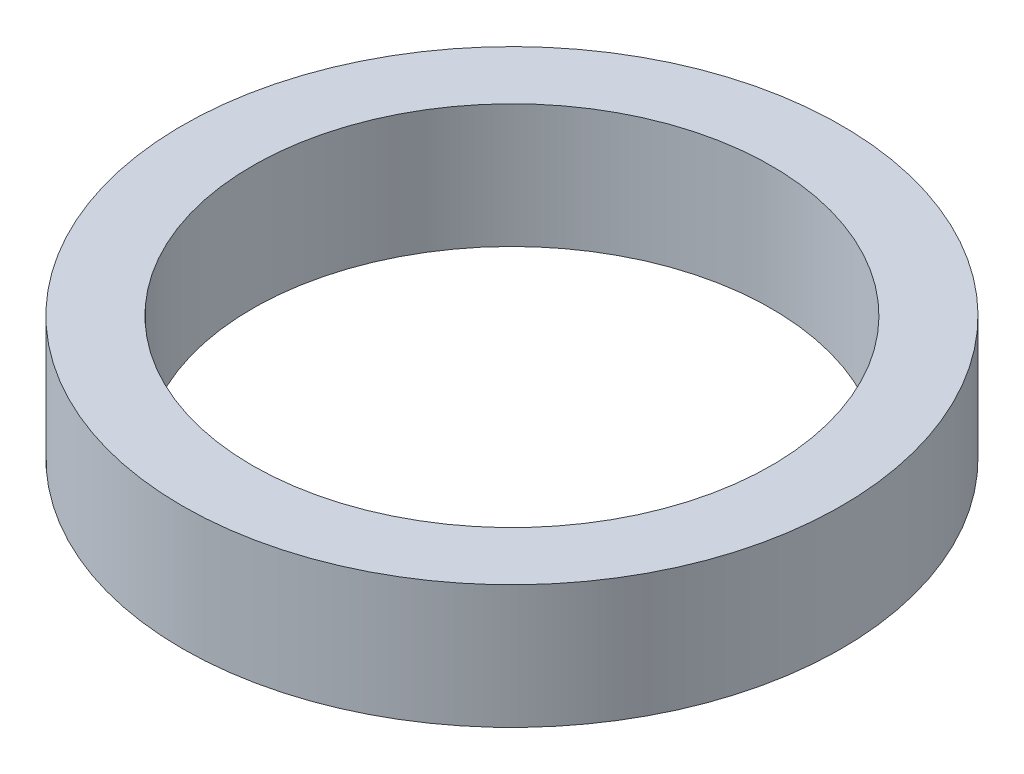
ISO-10303-21;
HEADER;
FILE_DESCRIPTION(('STEP AP214'),'2;1');
FILE_NAME('part.step','',(''),(''),'','','');
FILE_SCHEMA(('AUTOMOTIVE_DESIGN { 1 0 10303 214 1 1 1 1 }'));
ENDSEC;
DATA;
#1=APPLICATION_CONTEXT('core data for automotive mechanical design processes');
#2=APPLICATION_PROTOCOL_DEFINITION('international standard','automotive_design',2000,#1);
#3=PRODUCT_CONTEXT('',#1,'mechanical');
#4=PRODUCT('Part','Part','',(#3));
#5=PRODUCT_RELATED_PRODUCT_CATEGORY('part','',(#4));
#6=PRODUCT_DEFINITION_FORMATION('','',#4);
#7=PRODUCT_DEFINITION_CONTEXT('part definition',#1,'design');
#8=PRODUCT_DEFINITION('design','',#6,#7);
#9=PRODUCT_DEFINITION_SHAPE('','',#8);
#10=(LENGTH_UNIT() NAMED_UNIT(*) SI_UNIT(.MILLI.,.METRE.));
#11=(NAMED_UNIT(*) PLANE_ANGLE_UNIT() SI_UNIT($,.RADIAN.));
#12=(NAMED_UNIT(*) SI_UNIT($,.STERADIAN.) SOLID_ANGLE_UNIT());
#13=UNCERTAINTY_MEASURE_WITH_UNIT(LENGTH_MEASURE(1.E-05),#10,'distance_accuracy_value','');
#14=(GEOMETRIC_REPRESENTATION_CONTEXT(3) GLOBAL_UNCERTAINTY_ASSIGNED_CONTEXT((#13)) GLOBAL_UNIT_ASSIGNED_CONTEXT((#10,
#11,#12)) REPRESENTATION_CONTEXT('',''));
#15=CARTESIAN_POINT('',(0.,0.,0.));
#16=DIRECTION('',(0.,0.,1.));
#17=DIRECTION('',(1.,0.,0.));
#18=AXIS2_PLACEMENT_3D('',#15,#16,#17);
#19=CARTESIAN_POINT('',(0.,1.5,0.));
#20=DIRECTION('',(0.,1.,0.));
#21=DIRECTION('',(0.,0.,1.));
#22=AXIS2_PLACEMENT_3D('',#19,#20,#21);
#23=PLANE('',#22);
#24=CARTESIAN_POINT('',(0.,1.5,0.));
#25=DIRECTION('',(0.,1.,0.));
#26=DIRECTION('',(0.,0.,1.));
#27=AXIS2_PLACEMENT_3D('',#24,#25,#26);
#28=CIRCLE('',#27,4.);
#29=CARTESIAN_POINT('',(0.,1.5,4.));
#30=VERTEX_POINT('',#29);
#31=EDGE_CURVE('E10',#30,#30,#28,.T.);
#32=ORIENTED_EDGE('',*,*,#31,.T.);
#33=EDGE_LOOP('',(#32));
#34=FACE_BOUND('',#33,.T.);
#35=CARTESIAN_POINT('',(0.,1.5,0.));
#36=DIRECTION('',(0.,1.,0.));
#37=DIRECTION('',(0.,0.,1.));
#38=AXIS2_PLACEMENT_3D('',#35,#36,#37);
#39=CIRCLE('',#38,3.15);
#40=CARTESIAN_POINT('',(0.,1.5,3.15));
#41=VERTEX_POINT('',#40);
#42=EDGE_CURVE('E55',#41,#41,#39,.T.);
#43=ORIENTED_EDGE('',*,*,#42,.F.);
#44=EDGE_LOOP('',(#43));
#45=FACE_BOUND('',#44,.T.);
#46=ADVANCED_FACE('F41',(#34,#45),#23,.T.);
#47=CARTESIAN_POINT('',(0.,0.,0.));
#48=DIRECTION('',(0.,1.,0.));
#49=DIRECTION('',(0.,0.,1.));
#50=AXIS2_PLACEMENT_3D('',#47,#48,#49);
#51=PLANE('',#50);
#52=CARTESIAN_POINT('',(0.,0.,0.));
#53=DIRECTION('',(0.,1.,0.));
#54=DIRECTION('',(0.,0.,1.));
#55=AXIS2_PLACEMENT_3D('',#52,#53,#54);
#56=CIRCLE('',#55,4.);
#57=CARTESIAN_POINT('',(0.,0.,4.));
#58=VERTEX_POINT('',#57);
#59=EDGE_CURVE('E45',#58,#58,#56,.T.);
#60=ORIENTED_EDGE('',*,*,#59,.F.);
#61=EDGE_LOOP('',(#60));
#62=FACE_BOUND('',#61,.T.);
#63=CARTESIAN_POINT('',(0.,0.,0.));
#64=DIRECTION('',(0.,1.,0.));
#65=DIRECTION('',(0.,0.,1.));
#66=AXIS2_PLACEMENT_3D('',#63,#64,#65);
#67=CIRCLE('',#66,3.15);
#68=CARTESIAN_POINT('',(0.,0.,3.15));
#69=VERTEX_POINT('',#68);
#70=EDGE_CURVE('E57',#69,#69,#67,.T.);
#71=ORIENTED_EDGE('',*,*,#70,.T.);
#72=EDGE_LOOP('',(#71));
#73=FACE_BOUND('',#72,.T.);
#74=ADVANCED_FACE('F68',(#62,#73),#51,.F.);
#75=CARTESIAN_POINT('',(0.,1.5,0.));
#76=DIRECTION('',(0.,-1.,0.));
#77=DIRECTION('',(0.,0.,-1.));
#78=AXIS2_PLACEMENT_3D('',#75,#76,#77);
#79=CYLINDRICAL_SURFACE('',#78,4.);
#80=ORIENTED_EDGE('',*,*,#31,.F.);
#81=EDGE_LOOP('',(#80));
#82=FACE_BOUND('',#81,.T.);
#83=ORIENTED_EDGE('',*,*,#59,.T.);
#84=EDGE_LOOP('',(#83));
#85=FACE_BOUND('',#84,.T.);
#86=ADVANCED_FACE('F43',(#82,#85),#79,.T.);
#87=CARTESIAN_POINT('',(0.,1.5,0.));
#88=DIRECTION('',(0.,-1.,0.));
#89=DIRECTION('',(0.,0.,-1.));
#90=AXIS2_PLACEMENT_3D('',#87,#88,#89);
#91=CYLINDRICAL_SURFACE('',#90,3.15);
#92=ORIENTED_EDGE('',*,*,#42,.T.);
#93=EDGE_LOOP('',(#92));
#94=FACE_BOUND('',#93,.T.);
#95=ORIENTED_EDGE('',*,*,#70,.F.);
#96=EDGE_LOOP('',(#95));
#97=FACE_BOUND('',#96,.T.);
#98=ADVANCED_FACE('F64',(#94,#97),#91,.F.);
#99=CLOSED_SHELL('',(#46,#74,#86,#98));
#100=MANIFOLD_SOLID_BREP('B2',#99);
#101=ADVANCED_BREP_SHAPE_REPRESENTATION('',(#18,#100),#14);
#102=SHAPE_DEFINITION_REPRESENTATION(#9,#101);
ENDSEC;
END-ISO-10303-21;
